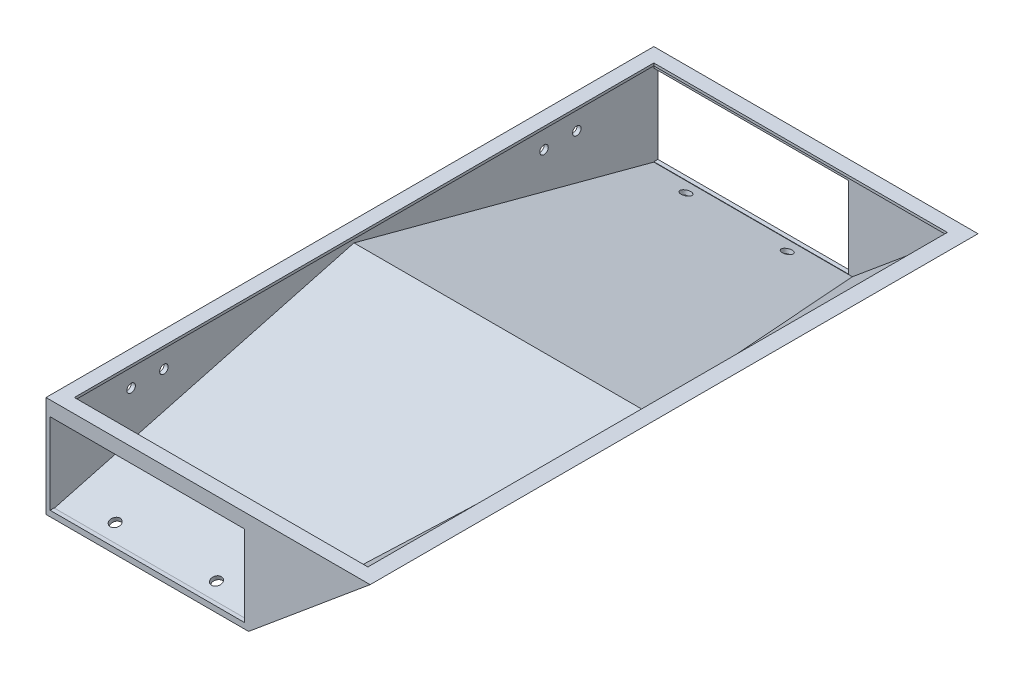
ISO-10303-21;
HEADER;
FILE_DESCRIPTION(('STEP AP214'),'2;1');
FILE_NAME('part.step','',(''),(''),'','','');
FILE_SCHEMA(('AUTOMOTIVE_DESIGN { 1 0 10303 214 1 1 1 1 }'));
ENDSEC;
DATA;
#1=APPLICATION_CONTEXT('core data for automotive mechanical design processes');
#2=APPLICATION_PROTOCOL_DEFINITION('international standard','automotive_design',2000,#1);
#3=PRODUCT_CONTEXT('',#1,'mechanical');
#4=PRODUCT('Part','Part','',(#3));
#5=PRODUCT_RELATED_PRODUCT_CATEGORY('part','',(#4));
#6=PRODUCT_DEFINITION_FORMATION('','',#4);
#7=PRODUCT_DEFINITION_CONTEXT('part definition',#1,'design');
#8=PRODUCT_DEFINITION('design','',#6,#7);
#9=PRODUCT_DEFINITION_SHAPE('','',#8);
#10=(LENGTH_UNIT() NAMED_UNIT(*) SI_UNIT(.MILLI.,.METRE.));
#11=(NAMED_UNIT(*) PLANE_ANGLE_UNIT() SI_UNIT($,.RADIAN.));
#12=(NAMED_UNIT(*) SI_UNIT($,.STERADIAN.) SOLID_ANGLE_UNIT());
#13=UNCERTAINTY_MEASURE_WITH_UNIT(LENGTH_MEASURE(1.E-05),#10,'distance_accuracy_value','');
#14=(GEOMETRIC_REPRESENTATION_CONTEXT(3) GLOBAL_UNCERTAINTY_ASSIGNED_CONTEXT((#13)) GLOBAL_UNIT_ASSIGNED_CONTEXT((#10,
#11,#12)) REPRESENTATION_CONTEXT('',''));
#15=CARTESIAN_POINT('',(0.,0.,0.));
#16=DIRECTION('',(0.,0.,1.));
#17=DIRECTION('',(1.,0.,0.));
#18=AXIS2_PLACEMENT_3D('',#15,#16,#17);
#19=CARTESIAN_POINT('',(0.,0.,2.54));
#20=DIRECTION('',(0.,0.,1.));
#21=DIRECTION('',(1.,0.,0.));
#22=AXIS2_PLACEMENT_3D('',#19,#20,#21);
#23=PLANE('',#22);
#24=DIRECTION('',(0.768221279597376,0.64018439966448,0.));
#25=VECTOR('',#24,1.);
#26=CARTESIAN_POINT('',(125.373931624852,1.95128205017733,2.53999999999999));
#27=LINE('',#26,#25);
#28=CARTESIAN_POINT('',(126.999705462919,3.30609358190003,2.54));
#29=VERTEX_POINT('',#28);
#30=CARTESIAN_POINT('',(197.327393164639,61.9125,2.53999999999999));
#31=VERTEX_POINT('',#30);
#32=EDGE_CURVE('E351',#29,#31,#27,.T.);
#33=ORIENTED_EDGE('',*,*,#32,.T.);
#34=DIRECTION('',(-1.,0.,0.));
#35=VECTOR('',#34,1.);
#36=CARTESIAN_POINT('',(203.2,61.9125,2.53999999999999));
#37=LINE('',#36,#35);
#38=CARTESIAN_POINT('',(2.54,61.9125,2.53999999999999));
#39=VERTEX_POINT('',#38);
#40=EDGE_CURVE('E53',#31,#39,#37,.T.);
#41=ORIENTED_EDGE('',*,*,#40,.T.);
#42=DIRECTION('',(0.,-1.,0.));
#43=VECTOR('',#42,1.);
#44=CARTESIAN_POINT('',(2.54,63.5,2.53999999999999));
#45=LINE('',#44,#43);
#46=CARTESIAN_POINT('',(2.54,54.356,2.54));
#47=VERTEX_POINT('',#46);
#48=EDGE_CURVE('E326',#39,#47,#45,.T.);
#49=ORIENTED_EDGE('',*,*,#48,.T.);
#50=DIRECTION('',(-1.,0.,0.));
#51=VECTOR('',#50,1.);
#52=CARTESIAN_POINT('',(0.,54.356,2.54));
#53=LINE('',#52,#51);
#54=CARTESIAN_POINT('',(124.46,54.356,2.54));
#55=VERTEX_POINT('',#54);
#56=EDGE_CURVE('E267',#55,#47,#53,.T.);
#57=ORIENTED_EDGE('',*,*,#56,.F.);
#58=DIRECTION('',(0.,1.,0.));
#59=VECTOR('',#58,1.);
#60=CARTESIAN_POINT('',(124.46,0.,2.54));
#61=LINE('',#60,#59);
#62=CARTESIAN_POINT('',(124.46,3.556,2.54));
#63=VERTEX_POINT('',#62);
#64=EDGE_CURVE('E274',#63,#55,#61,.T.);
#65=ORIENTED_EDGE('',*,*,#64,.F.);
#66=DIRECTION('',(1.,0.,0.));
#67=VECTOR('',#66,1.);
#68=CARTESIAN_POINT('',(0.,3.556,2.54));
#69=LINE('',#68,#67);
#70=CARTESIAN_POINT('',(2.54,3.556,2.54));
#71=VERTEX_POINT('',#70);
#72=EDGE_CURVE('E270',#71,#63,#69,.T.);
#73=ORIENTED_EDGE('',*,*,#72,.F.);
#74=CARTESIAN_POINT('',(2.54,3.30609358190003,2.54));
#75=VERTEX_POINT('',#74);
#76=EDGE_CURVE('E329',#71,#75,#45,.T.);
#77=ORIENTED_EDGE('',*,*,#76,.T.);
#78=DIRECTION('',(1.,0.,0.));
#79=VECTOR('',#78,1.);
#80=CARTESIAN_POINT('',(304.8,3.30609358190003,2.53999999999999));
#81=LINE('',#80,#79);
#82=EDGE_CURVE('E328',#75,#29,#81,.T.);
#83=ORIENTED_EDGE('',*,*,#82,.T.);
#84=EDGE_LOOP('',(#33,#41,#49,#57,#65,#73,#77,#83));
#85=FACE_BOUND('',#84,.T.);
#86=ADVANCED_FACE('F38',(#85),#23,.T.);
#87=CARTESIAN_POINT('',(2.54,63.5,381.));
#88=DIRECTION('',(1.,0.,0.));
#89=DIRECTION('',(0.,1.,0.));
#90=AXIS2_PLACEMENT_3D('',#87,#88,#89);
#91=PLANE('',#90);
#92=CARTESIAN_POINT('',(2.54,44.45,71.374));
#93=DIRECTION('',(1.,0.,0.));
#94=DIRECTION('',(0.,-1.,0.));
#95=AXIS2_PLACEMENT_3D('',#92,#93,#94);
#96=CIRCLE('',#95,2.66699999999997);
#97=CARTESIAN_POINT('',(2.54,41.783,71.374));
#98=VERTEX_POINT('',#97);
#99=EDGE_CURVE('E484',#98,#98,#96,.T.);
#100=ORIENTED_EDGE('',*,*,#99,.F.);
#101=EDGE_LOOP('',(#100));
#102=FACE_BOUND('',#101,.T.);
#103=CARTESIAN_POINT('',(2.54,44.45,50.8));
#104=DIRECTION('',(1.,0.,0.));
#105=DIRECTION('',(0.,-1.,0.));
#106=AXIS2_PLACEMENT_3D('',#103,#104,#105);
#107=CIRCLE('',#106,2.66699999999997);
#108=CARTESIAN_POINT('',(2.54,41.783,50.8));
#109=VERTEX_POINT('',#108);
#110=EDGE_CURVE('E490',#109,#109,#107,.T.);
#111=ORIENTED_EDGE('',*,*,#110,.F.);
#112=EDGE_LOOP('',(#111));
#113=FACE_BOUND('',#112,.T.);
#114=CARTESIAN_POINT('',(2.54,44.45,309.626));
#115=DIRECTION('',(-1.,0.,0.));
#116=DIRECTION('',(0.,-1.,0.));
#117=AXIS2_PLACEMENT_3D('',#114,#115,#116);
#118=CIRCLE('',#117,2.66699999999997);
#119=CARTESIAN_POINT('',(2.54,41.783,309.626));
#120=VERTEX_POINT('',#119);
#121=EDGE_CURVE('E225',#120,#120,#118,.T.);
#122=ORIENTED_EDGE('',*,*,#121,.T.);
#123=EDGE_LOOP('',(#122));
#124=FACE_BOUND('',#123,.T.);
#125=CARTESIAN_POINT('',(2.54,44.45,330.2));
#126=DIRECTION('',(-1.,0.,0.));
#127=DIRECTION('',(0.,-1.,0.));
#128=AXIS2_PLACEMENT_3D('',#125,#126,#127);
#129=CIRCLE('',#128,2.66699999999997);
#130=CARTESIAN_POINT('',(2.54,41.783,330.2));
#131=VERTEX_POINT('',#130);
#132=EDGE_CURVE('E483',#131,#131,#129,.T.);
#133=ORIENTED_EDGE('',*,*,#132,.T.);
#134=EDGE_LOOP('',(#133));
#135=FACE_BOUND('',#134,.T.);
#136=ORIENTED_EDGE('',*,*,#48,.F.);
#137=DIRECTION('',(0.,0.,1.));
#138=VECTOR('',#137,1.);
#139=CARTESIAN_POINT('',(2.54000000000004,61.9125,381.));
#140=LINE('',#139,#138);
#141=CARTESIAN_POINT('',(2.54000000000004,61.9125,378.46));
#142=VERTEX_POINT('',#141);
#143=EDGE_CURVE('E232',#39,#142,#140,.T.);
#144=ORIENTED_EDGE('',*,*,#143,.T.);
#145=DIRECTION('',(0.,-1.,0.));
#146=VECTOR('',#145,1.);
#147=CARTESIAN_POINT('',(2.54,63.5,378.46));
#148=LINE('',#147,#146);
#149=CARTESIAN_POINT('',(2.54,54.356,378.46));
#150=VERTEX_POINT('',#149);
#151=EDGE_CURVE('E336',#142,#150,#148,.T.);
#152=ORIENTED_EDGE('',*,*,#151,.T.);
#153=DIRECTION('',(0.,0.,1.));
#154=VECTOR('',#153,1.);
#155=CARTESIAN_POINT('',(2.54,54.356,378.46));
#156=LINE('',#155,#154);
#157=CARTESIAN_POINT('',(2.54,54.356,381.));
#158=VERTEX_POINT('',#157);
#159=EDGE_CURVE('E317',#150,#158,#156,.T.);
#160=ORIENTED_EDGE('',*,*,#159,.T.);
#161=DIRECTION('',(0.,-1.,0.));
#162=VECTOR('',#161,1.);
#163=CARTESIAN_POINT('',(2.54,3.556,381.));
#164=LINE('',#163,#162);
#165=CARTESIAN_POINT('',(2.54,3.556,381.));
#166=VERTEX_POINT('',#165);
#167=EDGE_CURVE('E296',#158,#166,#164,.T.);
#168=ORIENTED_EDGE('',*,*,#167,.T.);
#169=DIRECTION('',(0.,0.,1.));
#170=VECTOR('',#169,1.);
#171=CARTESIAN_POINT('',(2.54,3.556,378.46));
#172=LINE('',#171,#170);
#173=CARTESIAN_POINT('',(2.54,3.556,378.46));
#174=VERTEX_POINT('',#173);
#175=EDGE_CURVE('E307',#174,#166,#172,.T.);
#176=ORIENTED_EDGE('',*,*,#175,.F.);
#177=CARTESIAN_POINT('',(2.54,3.30609358190002,378.46));
#178=VERTEX_POINT('',#177);
#179=EDGE_CURVE('E339',#174,#178,#148,.T.);
#180=ORIENTED_EDGE('',*,*,#179,.T.);
#181=DIRECTION('',(0.,0.257662650560332,-0.966234939601247));
#182=VECTOR('',#181,1.);
#183=CARTESIAN_POINT('',(2.53999999999999,2.45423674658717,381.654463132423));
#184=LINE('',#183,#182);
#185=CARTESIAN_POINT('',(2.54,53.4287602485667,190.5));
#186=VERTEX_POINT('',#185);
#187=EDGE_CURVE('E332',#178,#186,#184,.T.);
#188=ORIENTED_EDGE('',*,*,#187,.T.);
#189=DIRECTION('',(0.,-0.257662650560332,-0.966234939601246));
#190=VECTOR('',#189,1.);
#191=CARTESIAN_POINT('',(2.53999999999999,53.2542367465871,189.845536867577));
#192=LINE('',#191,#190);
#193=EDGE_CURVE('E319',#186,#75,#192,.T.);
#194=ORIENTED_EDGE('',*,*,#193,.T.);
#195=ORIENTED_EDGE('',*,*,#76,.F.);
#196=DIRECTION('',(0.,0.,-1.));
#197=VECTOR('',#196,1.);
#198=CARTESIAN_POINT('',(2.54,3.556,2.54));
#199=LINE('',#198,#197);
#200=CARTESIAN_POINT('',(2.54,3.556,0.));
#201=VERTEX_POINT('',#200);
#202=EDGE_CURVE('E291',#71,#201,#199,.T.);
#203=ORIENTED_EDGE('',*,*,#202,.T.);
#204=DIRECTION('',(0.,-1.,0.));
#205=VECTOR('',#204,1.);
#206=CARTESIAN_POINT('',(2.54,0.,0.));
#207=LINE('',#206,#205);
#208=CARTESIAN_POINT('',(2.54,54.356,0.));
#209=VERTEX_POINT('',#208);
#210=EDGE_CURVE('E279',#209,#201,#207,.T.);
#211=ORIENTED_EDGE('',*,*,#210,.F.);
#212=DIRECTION('',(0.,0.,-1.));
#213=VECTOR('',#212,1.);
#214=CARTESIAN_POINT('',(2.54,54.356,2.54));
#215=LINE('',#214,#213);
#216=EDGE_CURVE('E293',#47,#209,#215,.T.);
#217=ORIENTED_EDGE('',*,*,#216,.F.);
#218=EDGE_LOOP('',(#136,#144,#152,#160,#168,#176,#180,#188,#194,#195,#203,#211,#217));
#219=FACE_BOUND('',#218,.T.);
#220=ADVANCED_FACE('F430',(#102,#113,#124,#135,#219),#91,.T.);
#221=CARTESIAN_POINT('',(125.373931624852,1.95128205017733,381.));
#222=DIRECTION('',(-0.64018439966448,0.768221279597376,0.));
#223=DIRECTION('',(-0.768221279597376,-0.64018439966448,0.));
#224=AXIS2_PLACEMENT_3D('',#221,#222,#223);
#225=PLANE('',#224);
#226=DIRECTION('',(0.768221279597376,0.64018439966448,0.));
#227=VECTOR('',#226,1.);
#228=CARTESIAN_POINT('',(125.373931624852,1.95128205017733,378.46));
#229=LINE('',#228,#227);
#230=CARTESIAN_POINT('',(126.999705462919,3.30609358190002,378.46));
#231=VERTEX_POINT('',#230);
#232=CARTESIAN_POINT('',(197.327393164639,61.9125,378.46));
#233=VERTEX_POINT('',#232);
#234=EDGE_CURVE('E342',#231,#233,#229,.T.);
#235=ORIENTED_EDGE('',*,*,#234,.T.);
#236=DIRECTION('',(0.,0.,-1.));
#237=VECTOR('',#236,1.);
#238=CARTESIAN_POINT('',(197.327393164639,61.9125,381.));
#239=LINE('',#238,#237);
#240=EDGE_CURVE('E61',#233,#31,#239,.T.);
#241=ORIENTED_EDGE('',*,*,#240,.T.);
#242=ORIENTED_EDGE('',*,*,#32,.F.);
#243=DIRECTION('',(-0.295397200622203,-0.246164333851836,-0.923116251944384));
#244=VECTOR('',#243,1.);
#245=CARTESIAN_POINT('',(229.960051582302,89.106382014719,324.291081623072));
#246=LINE('',#245,#244);
#247=CARTESIAN_POINT('',(187.146905462919,53.4287602485667,190.5));
#248=VERTEX_POINT('',#247);
#249=EDGE_CURVE('E348',#248,#29,#246,.T.);
#250=ORIENTED_EDGE('',*,*,#249,.F.);
#251=DIRECTION('',(0.295397200622203,0.246164333851836,-0.923116251944385));
#252=VECTOR('',#251,1.);
#253=CARTESIAN_POINT('',(126.066702089801,2.52859077096815,381.375635540995));
#254=LINE('',#253,#252);
#255=EDGE_CURVE('E345',#231,#248,#254,.T.);
#256=ORIENTED_EDGE('',*,*,#255,.F.);
#257=EDGE_LOOP('',(#235,#241,#242,#250,#256));
#258=FACE_BOUND('',#257,.T.);
#259=ADVANCED_FACE('F435',(#258),#225,.T.);
#260=CARTESIAN_POINT('',(0.,0.,378.46));
#261=DIRECTION('',(0.,0.,1.));
#262=DIRECTION('',(1.,0.,0.));
#263=AXIS2_PLACEMENT_3D('',#260,#261,#262);
#264=PLANE('',#263);
#265=DIRECTION('',(1.,0.,0.));
#266=VECTOR('',#265,1.);
#267=CARTESIAN_POINT('',(203.2,61.9125,378.46));
#268=LINE('',#267,#266);
#269=EDGE_CURVE('E238',#142,#233,#268,.T.);
#270=ORIENTED_EDGE('',*,*,#269,.T.);
#271=ORIENTED_EDGE('',*,*,#234,.F.);
#272=DIRECTION('',(1.,0.,0.));
#273=VECTOR('',#272,1.);
#274=CARTESIAN_POINT('',(304.8,3.30609358190002,378.46));
#275=LINE('',#274,#273);
#276=EDGE_CURVE('E338',#178,#231,#275,.T.);
#277=ORIENTED_EDGE('',*,*,#276,.F.);
#278=ORIENTED_EDGE('',*,*,#179,.F.);
#279=DIRECTION('',(1.,0.,0.));
#280=VECTOR('',#279,1.);
#281=CARTESIAN_POINT('',(2.54,3.556,378.46));
#282=LINE('',#281,#280);
#283=CARTESIAN_POINT('',(124.46,3.556,378.46));
#284=VERTEX_POINT('',#283);
#285=EDGE_CURVE('E297',#174,#284,#282,.T.);
#286=ORIENTED_EDGE('',*,*,#285,.T.);
#287=DIRECTION('',(0.,1.,0.));
#288=VECTOR('',#287,1.);
#289=CARTESIAN_POINT('',(124.46,3.556,378.46));
#290=LINE('',#289,#288);
#291=CARTESIAN_POINT('',(124.46,54.356,378.46));
#292=VERTEX_POINT('',#291);
#293=EDGE_CURVE('E300',#284,#292,#290,.T.);
#294=ORIENTED_EDGE('',*,*,#293,.T.);
#295=DIRECTION('',(-1.,0.,0.));
#296=VECTOR('',#295,1.);
#297=CARTESIAN_POINT('',(2.54,54.356,378.46));
#298=LINE('',#297,#296);
#299=EDGE_CURVE('E304',#292,#150,#298,.T.);
#300=ORIENTED_EDGE('',*,*,#299,.T.);
#301=ORIENTED_EDGE('',*,*,#151,.F.);
#302=EDGE_LOOP('',(#270,#271,#277,#278,#286,#294,#300,#301));
#303=FACE_BOUND('',#302,.T.);
#304=ADVANCED_FACE('F440',(#303),#264,.F.);
#305=CARTESIAN_POINT('',(0.,0.,0.));
#306=DIRECTION('',(0.,0.,1.));
#307=DIRECTION('',(1.,0.,0.));
#308=AXIS2_PLACEMENT_3D('',#305,#306,#307);
#309=PLANE('',#308);
#310=DIRECTION('',(0.,-1.,0.));
#311=VECTOR('',#310,1.);
#312=CARTESIAN_POINT('',(0.,63.5,0.));
#313=LINE('',#312,#311);
#314=CARTESIAN_POINT('',(0.,63.5,0.));
#315=VERTEX_POINT('',#314);
#316=CARTESIAN_POINT('',(0.,0.,0.));
#317=VERTEX_POINT('',#316);
#318=EDGE_CURVE('E367',#315,#317,#313,.T.);
#319=ORIENTED_EDGE('',*,*,#318,.F.);
#320=DIRECTION('',(-1.,0.,0.));
#321=VECTOR('',#320,1.);
#322=CARTESIAN_POINT('',(203.2,63.5,0.));
#323=LINE('',#322,#321);
#324=CARTESIAN_POINT('',(203.2,63.5,0.));
#325=VERTEX_POINT('',#324);
#326=EDGE_CURVE('E372',#325,#315,#323,.T.);
#327=ORIENTED_EDGE('',*,*,#326,.F.);
#328=DIRECTION('',(0.768221279597376,0.64018439966448,0.));
#329=VECTOR('',#328,1.);
#330=CARTESIAN_POINT('',(127.,0.,0.));
#331=LINE('',#330,#329);
#332=CARTESIAN_POINT('',(127.,0.,0.));
#333=VERTEX_POINT('',#332);
#334=EDGE_CURVE('E383',#333,#325,#331,.T.);
#335=ORIENTED_EDGE('',*,*,#334,.F.);
#336=DIRECTION('',(1.,0.,0.));
#337=VECTOR('',#336,1.);
#338=CARTESIAN_POINT('',(0.,0.,0.));
#339=LINE('',#338,#337);
#340=EDGE_CURVE('E381',#317,#333,#339,.T.);
#341=ORIENTED_EDGE('',*,*,#340,.F.);
#342=EDGE_LOOP('',(#319,#327,#335,#341));
#343=FACE_BOUND('',#342,.T.);
#344=DIRECTION('',(-1.,0.,0.));
#345=VECTOR('',#344,1.);
#346=CARTESIAN_POINT('',(0.,54.356,0.));
#347=LINE('',#346,#345);
#348=CARTESIAN_POINT('',(124.46,54.356,0.));
#349=VERTEX_POINT('',#348);
#350=EDGE_CURVE('E258',#349,#209,#347,.T.);
#351=ORIENTED_EDGE('',*,*,#350,.T.);
#352=ORIENTED_EDGE('',*,*,#210,.T.);
#353=DIRECTION('',(1.,0.,0.));
#354=VECTOR('',#353,1.);
#355=CARTESIAN_POINT('',(0.,3.556,0.));
#356=LINE('',#355,#354);
#357=CARTESIAN_POINT('',(124.46,3.556,0.));
#358=VERTEX_POINT('',#357);
#359=EDGE_CURVE('E282',#201,#358,#356,.T.);
#360=ORIENTED_EDGE('',*,*,#359,.T.);
#361=DIRECTION('',(0.,1.,0.));
#362=VECTOR('',#361,1.);
#363=CARTESIAN_POINT('',(124.46,0.,0.));
#364=LINE('',#363,#362);
#365=EDGE_CURVE('E271',#358,#349,#364,.T.);
#366=ORIENTED_EDGE('',*,*,#365,.T.);
#367=EDGE_LOOP('',(#351,#352,#360,#366));
#368=FACE_BOUND('',#367,.T.);
#369=ADVANCED_FACE('F397',(#343,#368),#309,.F.);
#370=CARTESIAN_POINT('',(203.2,63.5,381.));
#371=DIRECTION('',(0.,-1.,0.));
#372=DIRECTION('',(1.,0.,0.));
#373=AXIS2_PLACEMENT_3D('',#370,#371,#372);
#374=PLANE('',#373);
#375=ORIENTED_EDGE('',*,*,#326,.T.);
#376=DIRECTION('',(0.,0.,-1.));
#377=VECTOR('',#376,1.);
#378=CARTESIAN_POINT('',(0.,63.5,381.));
#379=LINE('',#378,#377);
#380=CARTESIAN_POINT('',(0.,63.5,381.));
#381=VERTEX_POINT('',#380);
#382=EDGE_CURVE('E46',#381,#315,#379,.T.);
#383=ORIENTED_EDGE('',*,*,#382,.F.);
#384=DIRECTION('',(-1.,0.,0.));
#385=VECTOR('',#384,1.);
#386=CARTESIAN_POINT('',(203.2,63.5,381.));
#387=LINE('',#386,#385);
#388=CARTESIAN_POINT('',(203.2,63.5,381.));
#389=VERTEX_POINT('',#388);
#390=EDGE_CURVE('E377',#389,#381,#387,.T.);
#391=ORIENTED_EDGE('',*,*,#390,.F.);
#392=DIRECTION('',(0.,0.,-1.));
#393=VECTOR('',#392,1.);
#394=CARTESIAN_POINT('',(203.2,63.5,381.));
#395=LINE('',#394,#393);
#396=EDGE_CURVE('E11',#389,#325,#395,.T.);
#397=ORIENTED_EDGE('',*,*,#396,.T.);
#398=EDGE_LOOP('',(#375,#383,#391,#397));
#399=FACE_BOUND('',#398,.T.);
#400=DIRECTION('',(-1.,0.,0.));
#401=VECTOR('',#400,1.);
#402=CARTESIAN_POINT('',(203.2,63.5,8.89000000000001));
#403=LINE('',#402,#401);
#404=CARTESIAN_POINT('',(192.882393164639,63.5,8.89000000000001));
#405=VERTEX_POINT('',#404);
#406=CARTESIAN_POINT('',(8.89000000000001,63.5,8.89000000000001));
#407=VERTEX_POINT('',#406);
#408=EDGE_CURVE('E195',#405,#407,#403,.T.);
#409=ORIENTED_EDGE('',*,*,#408,.F.);
#410=DIRECTION('',(0.,0.,-1.));
#411=VECTOR('',#410,1.);
#412=CARTESIAN_POINT('',(192.882393164639,63.5,381.));
#413=LINE('',#412,#411);
#414=CARTESIAN_POINT('',(192.882393164639,63.5,372.11));
#415=VERTEX_POINT('',#414);
#416=EDGE_CURVE('E214',#415,#405,#413,.T.);
#417=ORIENTED_EDGE('',*,*,#416,.F.);
#418=DIRECTION('',(1.,0.,0.));
#419=VECTOR('',#418,1.);
#420=CARTESIAN_POINT('',(203.2,63.5,372.11));
#421=LINE('',#420,#419);
#422=CARTESIAN_POINT('',(8.89000000000001,63.5,372.11));
#423=VERTEX_POINT('',#422);
#424=EDGE_CURVE('E224',#423,#415,#421,.T.);
#425=ORIENTED_EDGE('',*,*,#424,.F.);
#426=DIRECTION('',(0.,0.,1.));
#427=VECTOR('',#426,1.);
#428=CARTESIAN_POINT('',(8.89000000000001,63.5,381.));
#429=LINE('',#428,#427);
#430=EDGE_CURVE('E222',#407,#423,#429,.T.);
#431=ORIENTED_EDGE('',*,*,#430,.F.);
#432=EDGE_LOOP('',(#409,#417,#425,#431));
#433=FACE_BOUND('',#432,.T.);
#434=ADVANCED_FACE('F411',(#399,#433),#374,.F.);
#435=CARTESIAN_POINT('',(0.,63.5,381.));
#436=DIRECTION('',(1.,0.,0.));
#437=DIRECTION('',(0.,1.,0.));
#438=AXIS2_PLACEMENT_3D('',#435,#436,#437);
#439=PLANE('',#438);
#440=CARTESIAN_POINT('',(0.,44.45,71.374));
#441=DIRECTION('',(1.,0.,0.));
#442=DIRECTION('',(0.,-1.,0.));
#443=AXIS2_PLACEMENT_3D('',#440,#441,#442);
#444=CIRCLE('',#443,2.66699999999997);
#445=CARTESIAN_POINT('',(0.,41.783,71.374));
#446=VERTEX_POINT('',#445);
#447=EDGE_CURVE('E471',#446,#446,#444,.T.);
#448=ORIENTED_EDGE('',*,*,#447,.T.);
#449=EDGE_LOOP('',(#448));
#450=FACE_BOUND('',#449,.T.);
#451=CARTESIAN_POINT('',(0.,44.45,50.8));
#452=DIRECTION('',(1.,0.,0.));
#453=DIRECTION('',(0.,-1.,0.));
#454=AXIS2_PLACEMENT_3D('',#451,#452,#453);
#455=CIRCLE('',#454,2.66699999999997);
#456=CARTESIAN_POINT('',(0.,41.783,50.8));
#457=VERTEX_POINT('',#456);
#458=EDGE_CURVE('E475',#457,#457,#455,.T.);
#459=ORIENTED_EDGE('',*,*,#458,.T.);
#460=EDGE_LOOP('',(#459));
#461=FACE_BOUND('',#460,.T.);
#462=CARTESIAN_POINT('',(0.,44.45,309.626));
#463=DIRECTION('',(-1.,0.,0.));
#464=DIRECTION('',(0.,-1.,0.));
#465=AXIS2_PLACEMENT_3D('',#462,#463,#464);
#466=CIRCLE('',#465,2.66699999999997);
#467=CARTESIAN_POINT('',(0.,41.783,309.626));
#468=VERTEX_POINT('',#467);
#469=EDGE_CURVE('E479',#468,#468,#466,.T.);
#470=ORIENTED_EDGE('',*,*,#469,.F.);
#471=EDGE_LOOP('',(#470));
#472=FACE_BOUND('',#471,.T.);
#473=CARTESIAN_POINT('',(0.,44.45,330.2));
#474=DIRECTION('',(-1.,0.,0.));
#475=DIRECTION('',(0.,-1.,0.));
#476=AXIS2_PLACEMENT_3D('',#473,#474,#475);
#477=CIRCLE('',#476,2.66699999999997);
#478=CARTESIAN_POINT('',(0.,41.783,330.2));
#479=VERTEX_POINT('',#478);
#480=EDGE_CURVE('E217',#479,#479,#477,.T.);
#481=ORIENTED_EDGE('',*,*,#480,.F.);
#482=EDGE_LOOP('',(#481));
#483=FACE_BOUND('',#482,.T.);
#484=ORIENTED_EDGE('',*,*,#318,.T.);
#485=DIRECTION('',(0.,-0.257662650560332,-0.966234939601246));
#486=VECTOR('',#485,1.);
#487=CARTESIAN_POINT('',(0.,50.8,190.5));
#488=LINE('',#487,#486);
#489=CARTESIAN_POINT('',(0.,50.8,190.5));
#490=VERTEX_POINT('',#489);
#491=EDGE_CURVE('E344',#490,#317,#488,.T.);
#492=ORIENTED_EDGE('',*,*,#491,.F.);
#493=DIRECTION('',(0.,0.257662650560332,-0.966234939601246));
#494=VECTOR('',#493,1.);
#495=CARTESIAN_POINT('',(0.,0.,381.));
#496=LINE('',#495,#494);
#497=CARTESIAN_POINT('',(0.,0.,381.));
#498=VERTEX_POINT('',#497);
#499=EDGE_CURVE('E356',#498,#490,#496,.T.);
#500=ORIENTED_EDGE('',*,*,#499,.F.);
#501=DIRECTION('',(0.,-1.,0.));
#502=VECTOR('',#501,1.);
#503=CARTESIAN_POINT('',(0.,63.5,381.));
#504=LINE('',#503,#502);
#505=EDGE_CURVE('E368',#381,#498,#504,.T.);
#506=ORIENTED_EDGE('',*,*,#505,.F.);
#507=ORIENTED_EDGE('',*,*,#382,.T.);
#508=EDGE_LOOP('',(#484,#492,#500,#506,#507));
#509=FACE_BOUND('',#508,.T.);
#510=ADVANCED_FACE('F40',(#450,#461,#472,#483,#509),#439,.F.);
#511=CARTESIAN_POINT('',(127.,0.,381.));
#512=DIRECTION('',(-0.64018439966448,0.768221279597376,0.));
#513=DIRECTION('',(-0.768221279597376,-0.64018439966448,0.));
#514=AXIS2_PLACEMENT_3D('',#511,#512,#513);
#515=PLANE('',#514);
#516=DIRECTION('',(0.295397200622203,0.246164333851836,-0.923116251944385));
#517=VECTOR('',#516,1.);
#518=CARTESIAN_POINT('',(127.,0.,381.));
#519=LINE('',#518,#517);
#520=CARTESIAN_POINT('',(127.,0.,381.));
#521=VERTEX_POINT('',#520);
#522=CARTESIAN_POINT('',(187.96,50.8,190.5));
#523=VERTEX_POINT('',#522);
#524=EDGE_CURVE('E364',#521,#523,#519,.T.);
#525=ORIENTED_EDGE('',*,*,#524,.T.);
#526=DIRECTION('',(-0.295397200622203,-0.246164333851836,-0.923116251944384));
#527=VECTOR('',#526,1.);
#528=CARTESIAN_POINT('',(230.893349492501,86.5777912437509,324.666717164066));
#529=LINE('',#528,#527);
#530=EDGE_CURVE('E361',#523,#333,#529,.T.);
#531=ORIENTED_EDGE('',*,*,#530,.T.);
#532=ORIENTED_EDGE('',*,*,#334,.T.);
#533=ORIENTED_EDGE('',*,*,#396,.F.);
#534=DIRECTION('',(0.768221279597376,0.64018439966448,0.));
#535=VECTOR('',#534,1.);
#536=CARTESIAN_POINT('',(127.,0.,381.));
#537=LINE('',#536,#535);
#538=EDGE_CURVE('E375',#521,#389,#537,.T.);
#539=ORIENTED_EDGE('',*,*,#538,.F.);
#540=EDGE_LOOP('',(#525,#531,#532,#533,#539));
#541=FACE_BOUND('',#540,.T.);
#542=ADVANCED_FACE('F404',(#541),#515,.F.);
#543=CARTESIAN_POINT('',(0.,0.,381.));
#544=DIRECTION('',(0.,0.,1.));
#545=DIRECTION('',(1.,0.,0.));
#546=AXIS2_PLACEMENT_3D('',#543,#544,#545);
#547=PLANE('',#546);
#548=ORIENTED_EDGE('',*,*,#167,.F.);
#549=DIRECTION('',(-1.,0.,0.));
#550=VECTOR('',#549,1.);
#551=CARTESIAN_POINT('',(2.54,54.356,381.));
#552=LINE('',#551,#550);
#553=CARTESIAN_POINT('',(124.46,54.356,381.));
#554=VERTEX_POINT('',#553);
#555=EDGE_CURVE('E301',#554,#158,#552,.T.);
#556=ORIENTED_EDGE('',*,*,#555,.F.);
#557=DIRECTION('',(0.,1.,0.));
#558=VECTOR('',#557,1.);
#559=CARTESIAN_POINT('',(124.46,3.556,381.));
#560=LINE('',#559,#558);
#561=CARTESIAN_POINT('',(124.46,3.556,381.));
#562=VERTEX_POINT('',#561);
#563=EDGE_CURVE('E312',#562,#554,#560,.T.);
#564=ORIENTED_EDGE('',*,*,#563,.F.);
#565=DIRECTION('',(1.,0.,0.));
#566=VECTOR('',#565,1.);
#567=CARTESIAN_POINT('',(2.54,3.556,381.));
#568=LINE('',#567,#566);
#569=EDGE_CURVE('E309',#166,#562,#568,.T.);
#570=ORIENTED_EDGE('',*,*,#569,.F.);
#571=EDGE_LOOP('',(#548,#556,#564,#570));
#572=FACE_BOUND('',#571,.T.);
#573=ORIENTED_EDGE('',*,*,#505,.T.);
#574=DIRECTION('',(1.,0.,0.));
#575=VECTOR('',#574,1.);
#576=CARTESIAN_POINT('',(0.,0.,381.));
#577=LINE('',#576,#575);
#578=EDGE_CURVE('E371',#498,#521,#577,.T.);
#579=ORIENTED_EDGE('',*,*,#578,.T.);
#580=ORIENTED_EDGE('',*,*,#538,.T.);
#581=ORIENTED_EDGE('',*,*,#390,.T.);
#582=EDGE_LOOP('',(#573,#579,#580,#581));
#583=FACE_BOUND('',#582,.T.);
#584=ADVANCED_FACE('F410',(#572,#583),#547,.T.);
#585=CARTESIAN_POINT('',(304.8,0.,381.));
#586=DIRECTION('',(0.,0.966234939601246,0.257662650560332));
#587=DIRECTION('',(0.,-0.257662650560332,0.966234939601247));
#588=AXIS2_PLACEMENT_3D('',#585,#586,#587);
#589=PLANE('',#588);
#590=CARTESIAN_POINT('',(31.75,3.27231566211619,368.728816267064));
#591=DIRECTION('',(0.,-0.966234939601246,-0.257662650560332));
#592=DIRECTION('',(0.,0.257662650560332,-0.966234939601247));
#593=AXIS2_PLACEMENT_3D('',#590,#591,#592);
#594=CIRCLE('',#593,3.17500000000001);
#595=CARTESIAN_POINT('',(31.75,4.09039457764525,365.66102033383));
#596=VERTEX_POINT('',#595);
#597=EDGE_CURVE('E259',#596,#596,#594,.T.);
#598=ORIENTED_EDGE('',*,*,#597,.F.);
#599=EDGE_LOOP('',(#598));
#600=FACE_BOUND('',#599,.T.);
#601=CARTESIAN_POINT('',(95.25,3.27231566211619,368.728816267064));
#602=DIRECTION('',(0.,-0.966234939601246,-0.257662650560332));
#603=DIRECTION('',(0.,0.257662650560332,-0.966234939601247));
#604=AXIS2_PLACEMENT_3D('',#601,#602,#603);
#605=CIRCLE('',#604,3.17500000000001);
#606=CARTESIAN_POINT('',(95.25,4.09039457764525,365.66102033383));
#607=VERTEX_POINT('',#606);
#608=EDGE_CURVE('E246',#607,#607,#605,.T.);
#609=ORIENTED_EDGE('',*,*,#608,.F.);
#610=EDGE_LOOP('',(#609));
#611=FACE_BOUND('',#610,.T.);
#612=ORIENTED_EDGE('',*,*,#578,.F.);
#613=ORIENTED_EDGE('',*,*,#499,.T.);
#614=DIRECTION('',(-1.,0.,0.));
#615=VECTOR('',#614,1.);
#616=CARTESIAN_POINT('',(304.8,50.8,190.5));
#617=LINE('',#616,#615);
#618=EDGE_CURVE('E359',#523,#490,#617,.T.);
#619=ORIENTED_EDGE('',*,*,#618,.F.);
#620=ORIENTED_EDGE('',*,*,#524,.F.);
#621=EDGE_LOOP('',(#612,#613,#619,#620));
#622=FACE_BOUND('',#621,.T.);
#623=ADVANCED_FACE('F408',(#600,#611,#622),#589,.F.);
#624=CARTESIAN_POINT('',(304.8,50.8,190.5));
#625=DIRECTION('',(0.,0.966234939601247,-0.257662650560332));
#626=DIRECTION('',(0.,0.257662650560332,0.966234939601246));
#627=AXIS2_PLACEMENT_3D('',#624,#625,#626);
#628=PLANE('',#627);
#629=CARTESIAN_POINT('',(31.75,3.27231566211619,12.2711837329357));
#630=DIRECTION('',(0.,0.966234939601246,-0.257662650560332));
#631=DIRECTION('',(0.,0.257662650560332,0.966234939601247));
#632=AXIS2_PLACEMENT_3D('',#629,#630,#631);
#633=CIRCLE('',#632,3.17500000000001);
#634=CARTESIAN_POINT('',(31.75,4.09039457764525,15.3389796661697));
#635=VERTEX_POINT('',#634);
#636=EDGE_CURVE('E247',#635,#635,#633,.T.);
#637=ORIENTED_EDGE('',*,*,#636,.T.);
#638=EDGE_LOOP('',(#637));
#639=FACE_BOUND('',#638,.T.);
#640=CARTESIAN_POINT('',(95.25,3.27231566211619,12.2711837329357));
#641=DIRECTION('',(0.,0.966234939601246,-0.257662650560332));
#642=DIRECTION('',(0.,0.257662650560332,0.966234939601247));
#643=AXIS2_PLACEMENT_3D('',#640,#641,#642);
#644=CIRCLE('',#643,3.17500000000001);
#645=CARTESIAN_POINT('',(95.25,4.09039457764525,15.3389796661697));
#646=VERTEX_POINT('',#645);
#647=EDGE_CURVE('E242',#646,#646,#644,.T.);
#648=ORIENTED_EDGE('',*,*,#647,.T.);
#649=EDGE_LOOP('',(#648));
#650=FACE_BOUND('',#649,.T.);
#651=ORIENTED_EDGE('',*,*,#618,.T.);
#652=ORIENTED_EDGE('',*,*,#491,.T.);
#653=ORIENTED_EDGE('',*,*,#340,.T.);
#654=ORIENTED_EDGE('',*,*,#530,.F.);
#655=EDGE_LOOP('',(#651,#652,#653,#654));
#656=FACE_BOUND('',#655,.T.);
#657=ADVANCED_FACE('F401',(#639,#650,#656),#628,.F.);
#658=CARTESIAN_POINT('',(304.8,2.45423674658717,381.654463132423));
#659=DIRECTION('',(0.,0.966234939601246,0.257662650560332));
#660=DIRECTION('',(0.,-0.257662650560332,0.966234939601247));
#661=AXIS2_PLACEMENT_3D('',#658,#659,#660);
#662=PLANE('',#661);
#663=CARTESIAN_POINT('',(31.75,5.72655240870336,369.383279399487));
#664=DIRECTION('',(0.,-0.966234939601246,-0.257662650560332));
#665=DIRECTION('',(0.,0.257662650560332,-0.966234939601247));
#666=AXIS2_PLACEMENT_3D('',#663,#664,#665);
#667=CIRCLE('',#666,3.17500000000001);
#668=CARTESIAN_POINT('',(31.75,6.54463132423242,366.315483466254));
#669=VERTEX_POINT('',#668);
#670=EDGE_CURVE('E255',#669,#669,#667,.T.);
#671=ORIENTED_EDGE('',*,*,#670,.T.);
#672=EDGE_LOOP('',(#671));
#673=FACE_BOUND('',#672,.T.);
#674=CARTESIAN_POINT('',(95.25,5.72655240870336,369.383279399487));
#675=DIRECTION('',(0.,-0.966234939601246,-0.257662650560332));
#676=DIRECTION('',(0.,0.257662650560332,-0.966234939601247));
#677=AXIS2_PLACEMENT_3D('',#674,#675,#676);
#678=CIRCLE('',#677,3.17500000000001);
#679=CARTESIAN_POINT('',(95.25,6.54463132423242,366.315483466254));
#680=VERTEX_POINT('',#679);
#681=EDGE_CURVE('E262',#680,#680,#678,.T.);
#682=ORIENTED_EDGE('',*,*,#681,.T.);
#683=EDGE_LOOP('',(#682));
#684=FACE_BOUND('',#683,.T.);
#685=ORIENTED_EDGE('',*,*,#276,.T.);
#686=ORIENTED_EDGE('',*,*,#255,.T.);
#687=DIRECTION('',(-1.,0.,0.));
#688=VECTOR('',#687,1.);
#689=CARTESIAN_POINT('',(304.8,53.4287602485667,190.5));
#690=LINE('',#689,#688);
#691=EDGE_CURVE('E335',#248,#186,#690,.T.);
#692=ORIENTED_EDGE('',*,*,#691,.T.);
#693=ORIENTED_EDGE('',*,*,#187,.F.);
#694=EDGE_LOOP('',(#685,#686,#692,#693));
#695=FACE_BOUND('',#694,.T.);
#696=ADVANCED_FACE('F442',(#673,#684,#695),#662,.T.);
#697=CARTESIAN_POINT('',(304.8,53.2542367465871,189.845536867577));
#698=DIRECTION('',(0.,0.966234939601247,-0.257662650560332));
#699=DIRECTION('',(0.,0.257662650560332,0.966234939601246));
#700=AXIS2_PLACEMENT_3D('',#697,#698,#699);
#701=PLANE('',#700);
#702=CARTESIAN_POINT('',(31.75,5.72655240870336,11.6167206005125));
#703=DIRECTION('',(0.,0.966234939601246,-0.257662650560332));
#704=DIRECTION('',(0.,0.257662650560332,0.966234939601247));
#705=AXIS2_PLACEMENT_3D('',#702,#703,#704);
#706=CIRCLE('',#705,3.17500000000001);
#707=CARTESIAN_POINT('',(31.75,6.54463132423242,14.6845165337465));
#708=VERTEX_POINT('',#707);
#709=EDGE_CURVE('E243',#708,#708,#706,.T.);
#710=ORIENTED_EDGE('',*,*,#709,.F.);
#711=EDGE_LOOP('',(#710));
#712=FACE_BOUND('',#711,.T.);
#713=CARTESIAN_POINT('',(95.25,5.72655240870336,11.6167206005125));
#714=DIRECTION('',(0.,0.966234939601246,-0.257662650560332));
#715=DIRECTION('',(0.,0.257662650560332,0.966234939601247));
#716=AXIS2_PLACEMENT_3D('',#713,#714,#715);
#717=CIRCLE('',#716,3.17500000000001);
#718=CARTESIAN_POINT('',(95.25,6.54463132423242,14.6845165337465));
#719=VERTEX_POINT('',#718);
#720=EDGE_CURVE('E250',#719,#719,#717,.T.);
#721=ORIENTED_EDGE('',*,*,#720,.F.);
#722=EDGE_LOOP('',(#721));
#723=FACE_BOUND('',#722,.T.);
#724=ORIENTED_EDGE('',*,*,#691,.F.);
#725=ORIENTED_EDGE('',*,*,#249,.T.);
#726=ORIENTED_EDGE('',*,*,#82,.F.);
#727=ORIENTED_EDGE('',*,*,#193,.F.);
#728=EDGE_LOOP('',(#724,#725,#726,#727));
#729=FACE_BOUND('',#728,.T.);
#730=ADVANCED_FACE('F445',(#712,#723,#729),#701,.T.);
#731=CARTESIAN_POINT('',(2.54,54.356,378.46));
#732=DIRECTION('',(0.,1.,0.));
#733=DIRECTION('',(0.,0.,1.));
#734=AXIS2_PLACEMENT_3D('',#731,#732,#733);
#735=PLANE('',#734);
#736=ORIENTED_EDGE('',*,*,#555,.T.);
#737=ORIENTED_EDGE('',*,*,#159,.F.);
#738=ORIENTED_EDGE('',*,*,#299,.F.);
#739=DIRECTION('',(0.,0.,1.));
#740=VECTOR('',#739,1.);
#741=CARTESIAN_POINT('',(124.46,54.356,378.46));
#742=LINE('',#741,#740);
#743=EDGE_CURVE('E320',#292,#554,#742,.T.);
#744=ORIENTED_EDGE('',*,*,#743,.T.);
#745=EDGE_LOOP('',(#736,#737,#738,#744));
#746=FACE_BOUND('',#745,.T.);
#747=ADVANCED_FACE('F449',(#746),#735,.F.);
#748=CARTESIAN_POINT('',(124.46,3.556,378.46));
#749=DIRECTION('',(1.,0.,0.));
#750=DIRECTION('',(0.,0.,-1.));
#751=AXIS2_PLACEMENT_3D('',#748,#749,#750);
#752=PLANE('',#751);
#753=ORIENTED_EDGE('',*,*,#563,.T.);
#754=ORIENTED_EDGE('',*,*,#743,.F.);
#755=ORIENTED_EDGE('',*,*,#293,.F.);
#756=DIRECTION('',(0.,0.,1.));
#757=VECTOR('',#756,1.);
#758=CARTESIAN_POINT('',(124.46,3.556,378.46));
#759=LINE('',#758,#757);
#760=EDGE_CURVE('E322',#284,#562,#759,.T.);
#761=ORIENTED_EDGE('',*,*,#760,.T.);
#762=EDGE_LOOP('',(#753,#754,#755,#761));
#763=FACE_BOUND('',#762,.T.);
#764=ADVANCED_FACE('F730',(#763),#752,.F.);
#765=CARTESIAN_POINT('',(2.54,3.556,378.46));
#766=DIRECTION('',(0.,-1.,0.));
#767=DIRECTION('',(0.,0.,-1.));
#768=AXIS2_PLACEMENT_3D('',#765,#766,#767);
#769=PLANE('',#768);
#770=ORIENTED_EDGE('',*,*,#569,.T.);
#771=ORIENTED_EDGE('',*,*,#760,.F.);
#772=ORIENTED_EDGE('',*,*,#285,.F.);
#773=ORIENTED_EDGE('',*,*,#175,.T.);
#774=EDGE_LOOP('',(#770,#771,#772,#773));
#775=FACE_BOUND('',#774,.T.);
#776=ADVANCED_FACE('F714',(#775),#769,.F.);
#777=CARTESIAN_POINT('',(0.,54.356,2.54));
#778=DIRECTION('',(0.,-1.,0.));
#779=DIRECTION('',(0.,0.,-1.));
#780=AXIS2_PLACEMENT_3D('',#777,#778,#779);
#781=PLANE('',#780);
#782=ORIENTED_EDGE('',*,*,#350,.F.);
#783=DIRECTION('',(0.,0.,-1.));
#784=VECTOR('',#783,1.);
#785=CARTESIAN_POINT('',(124.46,54.356,2.54));
#786=LINE('',#785,#784);
#787=EDGE_CURVE('E276',#55,#349,#786,.T.);
#788=ORIENTED_EDGE('',*,*,#787,.F.);
#789=ORIENTED_EDGE('',*,*,#56,.T.);
#790=ORIENTED_EDGE('',*,*,#216,.T.);
#791=EDGE_LOOP('',(#782,#788,#789,#790));
#792=FACE_BOUND('',#791,.T.);
#793=ADVANCED_FACE('F704',(#792),#781,.T.);
#794=CARTESIAN_POINT('',(0.,3.556,2.54));
#795=DIRECTION('',(0.,1.,0.));
#796=DIRECTION('',(0.,0.,1.));
#797=AXIS2_PLACEMENT_3D('',#794,#795,#796);
#798=PLANE('',#797);
#799=ORIENTED_EDGE('',*,*,#359,.F.);
#800=ORIENTED_EDGE('',*,*,#202,.F.);
#801=ORIENTED_EDGE('',*,*,#72,.T.);
#802=DIRECTION('',(0.,0.,-1.));
#803=VECTOR('',#802,1.);
#804=CARTESIAN_POINT('',(124.46,3.556,2.54));
#805=LINE('',#804,#803);
#806=EDGE_CURVE('E289',#63,#358,#805,.T.);
#807=ORIENTED_EDGE('',*,*,#806,.T.);
#808=EDGE_LOOP('',(#799,#800,#801,#807));
#809=FACE_BOUND('',#808,.T.);
#810=ADVANCED_FACE('F694',(#809),#798,.T.);
#811=CARTESIAN_POINT('',(124.46,0.,2.54));
#812=DIRECTION('',(-1.,0.,0.));
#813=DIRECTION('',(0.,0.,1.));
#814=AXIS2_PLACEMENT_3D('',#811,#812,#813);
#815=PLANE('',#814);
#816=ORIENTED_EDGE('',*,*,#365,.F.);
#817=ORIENTED_EDGE('',*,*,#806,.F.);
#818=ORIENTED_EDGE('',*,*,#64,.T.);
#819=ORIENTED_EDGE('',*,*,#787,.T.);
#820=EDGE_LOOP('',(#816,#817,#818,#819));
#821=FACE_BOUND('',#820,.T.);
#822=ADVANCED_FACE('F671',(#821),#815,.T.);
#823=CARTESIAN_POINT('',(95.25,5.72655240870336,369.383279399487));
#824=DIRECTION('',(0.,-0.966234939601247,-0.257662650560332));
#825=DIRECTION('',(0.,0.257662650560332,-0.966234939601246));
#826=AXIS2_PLACEMENT_3D('',#823,#824,#825);
#827=CYLINDRICAL_SURFACE('',#826,3.17500000000001);
#828=ORIENTED_EDGE('',*,*,#681,.F.);
#829=EDGE_LOOP('',(#828));
#830=FACE_BOUND('',#829,.T.);
#831=ORIENTED_EDGE('',*,*,#608,.T.);
#832=EDGE_LOOP('',(#831));
#833=FACE_BOUND('',#832,.T.);
#834=ADVANCED_FACE('F661',(#830,#833),#827,.F.);
#835=CARTESIAN_POINT('',(31.75,5.72655240870336,369.383279399487));
#836=DIRECTION('',(0.,-0.966234939601247,-0.257662650560332));
#837=DIRECTION('',(0.,0.257662650560332,-0.966234939601246));
#838=AXIS2_PLACEMENT_3D('',#835,#836,#837);
#839=CYLINDRICAL_SURFACE('',#838,3.17500000000001);
#840=ORIENTED_EDGE('',*,*,#670,.F.);
#841=EDGE_LOOP('',(#840));
#842=FACE_BOUND('',#841,.T.);
#843=ORIENTED_EDGE('',*,*,#597,.T.);
#844=EDGE_LOOP('',(#843));
#845=FACE_BOUND('',#844,.T.);
#846=ADVANCED_FACE('F635',(#842,#845),#839,.F.);
#847=CARTESIAN_POINT('',(95.25,5.72655240870336,11.6167206005125));
#848=DIRECTION('',(0.,-0.966234939601247,0.257662650560332));
#849=DIRECTION('',(0.,-0.257662650560332,-0.966234939601246));
#850=AXIS2_PLACEMENT_3D('',#847,#848,#849);
#851=CYLINDRICAL_SURFACE('',#850,3.17500000000001);
#852=ORIENTED_EDGE('',*,*,#720,.T.);
#853=EDGE_LOOP('',(#852));
#854=FACE_BOUND('',#853,.T.);
#855=ORIENTED_EDGE('',*,*,#647,.F.);
#856=EDGE_LOOP('',(#855));
#857=FACE_BOUND('',#856,.T.);
#858=ADVANCED_FACE('F625',(#854,#857),#851,.F.);
#859=CARTESIAN_POINT('',(31.75,5.72655240870336,11.6167206005125));
#860=DIRECTION('',(0.,-0.966234939601247,0.257662650560332));
#861=DIRECTION('',(0.,-0.257662650560332,-0.966234939601246));
#862=AXIS2_PLACEMENT_3D('',#859,#860,#861);
#863=CYLINDRICAL_SURFACE('',#862,3.17500000000001);
#864=ORIENTED_EDGE('',*,*,#709,.T.);
#865=EDGE_LOOP('',(#864));
#866=FACE_BOUND('',#865,.T.);
#867=ORIENTED_EDGE('',*,*,#636,.F.);
#868=EDGE_LOOP('',(#867));
#869=FACE_BOUND('',#868,.T.);
#870=ADVANCED_FACE('F587',(#866,#869),#863,.F.);
#871=CARTESIAN_POINT('',(0.,61.9125,0.));
#872=DIRECTION('',(0.,1.,0.));
#873=DIRECTION('',(-1.,0.,0.));
#874=AXIS2_PLACEMENT_3D('',#871,#872,#873);
#875=PLANE('',#874);
#876=ORIENTED_EDGE('',*,*,#240,.F.);
#877=ORIENTED_EDGE('',*,*,#269,.F.);
#878=ORIENTED_EDGE('',*,*,#143,.F.);
#879=ORIENTED_EDGE('',*,*,#40,.F.);
#880=EDGE_LOOP('',(#876,#877,#878,#879));
#881=FACE_BOUND('',#880,.T.);
#882=DIRECTION('',(0.,0.,-1.));
#883=VECTOR('',#882,1.);
#884=CARTESIAN_POINT('',(192.882393164639,61.9125,381.));
#885=LINE('',#884,#883);
#886=CARTESIAN_POINT('',(192.882393164639,61.9125,372.11));
#887=VERTEX_POINT('',#886);
#888=CARTESIAN_POINT('',(192.882393164639,61.9125,8.89000000000001));
#889=VERTEX_POINT('',#888);
#890=EDGE_CURVE('E200',#887,#889,#885,.T.);
#891=ORIENTED_EDGE('',*,*,#890,.T.);
#892=DIRECTION('',(-1.,0.,0.));
#893=VECTOR('',#892,1.);
#894=CARTESIAN_POINT('',(203.2,61.9125,8.89000000000001));
#895=LINE('',#894,#893);
#896=CARTESIAN_POINT('',(8.89000000000001,61.9125,8.89000000000001));
#897=VERTEX_POINT('',#896);
#898=EDGE_CURVE('E192',#889,#897,#895,.T.);
#899=ORIENTED_EDGE('',*,*,#898,.T.);
#900=DIRECTION('',(0.,0.,1.));
#901=VECTOR('',#900,1.);
#902=CARTESIAN_POINT('',(8.89000000000001,61.9125,381.));
#903=LINE('',#902,#901);
#904=CARTESIAN_POINT('',(8.89000000000001,61.9125,372.11));
#905=VERTEX_POINT('',#904);
#906=EDGE_CURVE('E204',#897,#905,#903,.T.);
#907=ORIENTED_EDGE('',*,*,#906,.T.);
#908=DIRECTION('',(1.,0.,0.));
#909=VECTOR('',#908,1.);
#910=CARTESIAN_POINT('',(203.2,61.9125,372.11));
#911=LINE('',#910,#909);
#912=EDGE_CURVE('E208',#905,#887,#911,.T.);
#913=ORIENTED_EDGE('',*,*,#912,.T.);
#914=EDGE_LOOP('',(#891,#899,#907,#913));
#915=FACE_BOUND('',#914,.T.);
#916=ADVANCED_FACE('F211',(#881,#915),#875,.F.);
#917=CARTESIAN_POINT('',(203.2,61.9125,8.89000000000001));
#918=DIRECTION('',(0.,0.,-1.));
#919=DIRECTION('',(-1.,0.,0.));
#920=AXIS2_PLACEMENT_3D('',#917,#918,#919);
#921=PLANE('',#920);
#922=ORIENTED_EDGE('',*,*,#408,.T.);
#923=DIRECTION('',(0.,1.,0.));
#924=VECTOR('',#923,1.);
#925=CARTESIAN_POINT('',(8.89000000000001,61.9125,8.89000000000001));
#926=LINE('',#925,#924);
#927=EDGE_CURVE('E188',#897,#407,#926,.T.);
#928=ORIENTED_EDGE('',*,*,#927,.F.);
#929=ORIENTED_EDGE('',*,*,#898,.F.);
#930=DIRECTION('',(0.,1.,0.));
#931=VECTOR('',#930,1.);
#932=CARTESIAN_POINT('',(192.882393164639,61.9125,8.89000000000001));
#933=LINE('',#932,#931);
#934=EDGE_CURVE('E230',#889,#405,#933,.T.);
#935=ORIENTED_EDGE('',*,*,#934,.T.);
#936=EDGE_LOOP('',(#922,#928,#929,#935));
#937=FACE_BOUND('',#936,.T.);
#938=ADVANCED_FACE('F190',(#937),#921,.F.);
#939=CARTESIAN_POINT('',(192.882393164639,61.9125,381.));
#940=DIRECTION('',(1.,0.,0.));
#941=DIRECTION('',(0.,0.,-1.));
#942=AXIS2_PLACEMENT_3D('',#939,#940,#941);
#943=PLANE('',#942);
#944=ORIENTED_EDGE('',*,*,#416,.T.);
#945=ORIENTED_EDGE('',*,*,#934,.F.);
#946=ORIENTED_EDGE('',*,*,#890,.F.);
#947=DIRECTION('',(0.,1.,0.));
#948=VECTOR('',#947,1.);
#949=CARTESIAN_POINT('',(192.882393164639,61.9125,372.11));
#950=LINE('',#949,#948);
#951=EDGE_CURVE('E233',#887,#415,#950,.T.);
#952=ORIENTED_EDGE('',*,*,#951,.T.);
#953=EDGE_LOOP('',(#944,#945,#946,#952));
#954=FACE_BOUND('',#953,.T.);
#955=ADVANCED_FACE('F420',(#954),#943,.F.);
#956=CARTESIAN_POINT('',(203.2,61.9125,372.11));
#957=DIRECTION('',(0.,0.,1.));
#958=DIRECTION('',(1.,0.,0.));
#959=AXIS2_PLACEMENT_3D('',#956,#957,#958);
#960=PLANE('',#959);
#961=ORIENTED_EDGE('',*,*,#424,.T.);
#962=ORIENTED_EDGE('',*,*,#951,.F.);
#963=ORIENTED_EDGE('',*,*,#912,.F.);
#964=DIRECTION('',(0.,1.,0.));
#965=VECTOR('',#964,1.);
#966=CARTESIAN_POINT('',(8.89000000000001,61.9125,372.11));
#967=LINE('',#966,#965);
#968=EDGE_CURVE('E199',#905,#423,#967,.T.);
#969=ORIENTED_EDGE('',*,*,#968,.T.);
#970=EDGE_LOOP('',(#961,#962,#963,#969));
#971=FACE_BOUND('',#970,.T.);
#972=ADVANCED_FACE('F418',(#971),#960,.F.);
#973=CARTESIAN_POINT('',(8.89000000000001,61.9125,381.));
#974=DIRECTION('',(-1.,0.,0.));
#975=DIRECTION('',(0.,0.,1.));
#976=AXIS2_PLACEMENT_3D('',#973,#974,#975);
#977=PLANE('',#976);
#978=ORIENTED_EDGE('',*,*,#430,.T.);
#979=ORIENTED_EDGE('',*,*,#968,.F.);
#980=ORIENTED_EDGE('',*,*,#906,.F.);
#981=ORIENTED_EDGE('',*,*,#927,.T.);
#982=EDGE_LOOP('',(#978,#979,#980,#981));
#983=FACE_BOUND('',#982,.T.);
#984=ADVANCED_FACE('F205',(#983),#977,.F.);
#985=CARTESIAN_POINT('',(2.54,44.45,330.2));
#986=DIRECTION('',(-1.,0.,0.));
#987=DIRECTION('',(0.,-1.,0.));
#988=AXIS2_PLACEMENT_3D('',#985,#986,#987);
#989=CYLINDRICAL_SURFACE('',#988,2.66699999999997);
#990=ORIENTED_EDGE('',*,*,#132,.F.);
#991=EDGE_LOOP('',(#990));
#992=FACE_BOUND('',#991,.T.);
#993=ORIENTED_EDGE('',*,*,#480,.T.);
#994=EDGE_LOOP('',(#993));
#995=FACE_BOUND('',#994,.T.);
#996=ADVANCED_FACE('F502',(#992,#995),#989,.F.);
#997=CARTESIAN_POINT('',(2.54,44.45,309.626));
#998=DIRECTION('',(-1.,0.,0.));
#999=DIRECTION('',(0.,-1.,0.));
#1000=AXIS2_PLACEMENT_3D('',#997,#998,#999);
#1001=CYLINDRICAL_SURFACE('',#1000,2.66699999999997);
#1002=ORIENTED_EDGE('',*,*,#121,.F.);
#1003=EDGE_LOOP('',(#1002));
#1004=FACE_BOUND('',#1003,.T.);
#1005=ORIENTED_EDGE('',*,*,#469,.T.);
#1006=EDGE_LOOP('',(#1005));
#1007=FACE_BOUND('',#1006,.T.);
#1008=ADVANCED_FACE('F499',(#1004,#1007),#1001,.F.);
#1009=CARTESIAN_POINT('',(2.54,44.45,50.8));
#1010=DIRECTION('',(-1.,0.,0.));
#1011=DIRECTION('',(0.,-1.,0.));
#1012=AXIS2_PLACEMENT_3D('',#1009,#1010,#1011);
#1013=CYLINDRICAL_SURFACE('',#1012,2.66699999999997);
#1014=ORIENTED_EDGE('',*,*,#110,.T.);
#1015=EDGE_LOOP('',(#1014));
#1016=FACE_BOUND('',#1015,.T.);
#1017=ORIENTED_EDGE('',*,*,#458,.F.);
#1018=EDGE_LOOP('',(#1017));
#1019=FACE_BOUND('',#1018,.T.);
#1020=ADVANCED_FACE('F501',(#1016,#1019),#1013,.F.);
#1021=CARTESIAN_POINT('',(2.54,44.45,71.374));
#1022=DIRECTION('',(-1.,0.,0.));
#1023=DIRECTION('',(0.,-1.,0.));
#1024=AXIS2_PLACEMENT_3D('',#1021,#1022,#1023);
#1025=CYLINDRICAL_SURFACE('',#1024,2.66699999999997);
#1026=ORIENTED_EDGE('',*,*,#99,.T.);
#1027=EDGE_LOOP('',(#1026));
#1028=FACE_BOUND('',#1027,.T.);
#1029=ORIENTED_EDGE('',*,*,#447,.F.);
#1030=EDGE_LOOP('',(#1029));
#1031=FACE_BOUND('',#1030,.T.);
#1032=ADVANCED_FACE('F509',(#1028,#1031),#1025,.F.);
#1033=CLOSED_SHELL('',(#86,#220,#259,#304,#369,#434,#510,#542,#584,#623,#657,#696,#730,#747,
#764,#776,#793,#810,#822,#834,#846,#858,#870,#916,#938,#955,#972,#984,#996,#1008,#1020,#1032));
#1034=MANIFOLD_SOLID_BREP('B2',#1033);
#1035=ADVANCED_BREP_SHAPE_REPRESENTATION('',(#18,#1034),#14);
#1036=SHAPE_DEFINITION_REPRESENTATION(#9,#1035);
ENDSEC;
END-ISO-10303-21;
